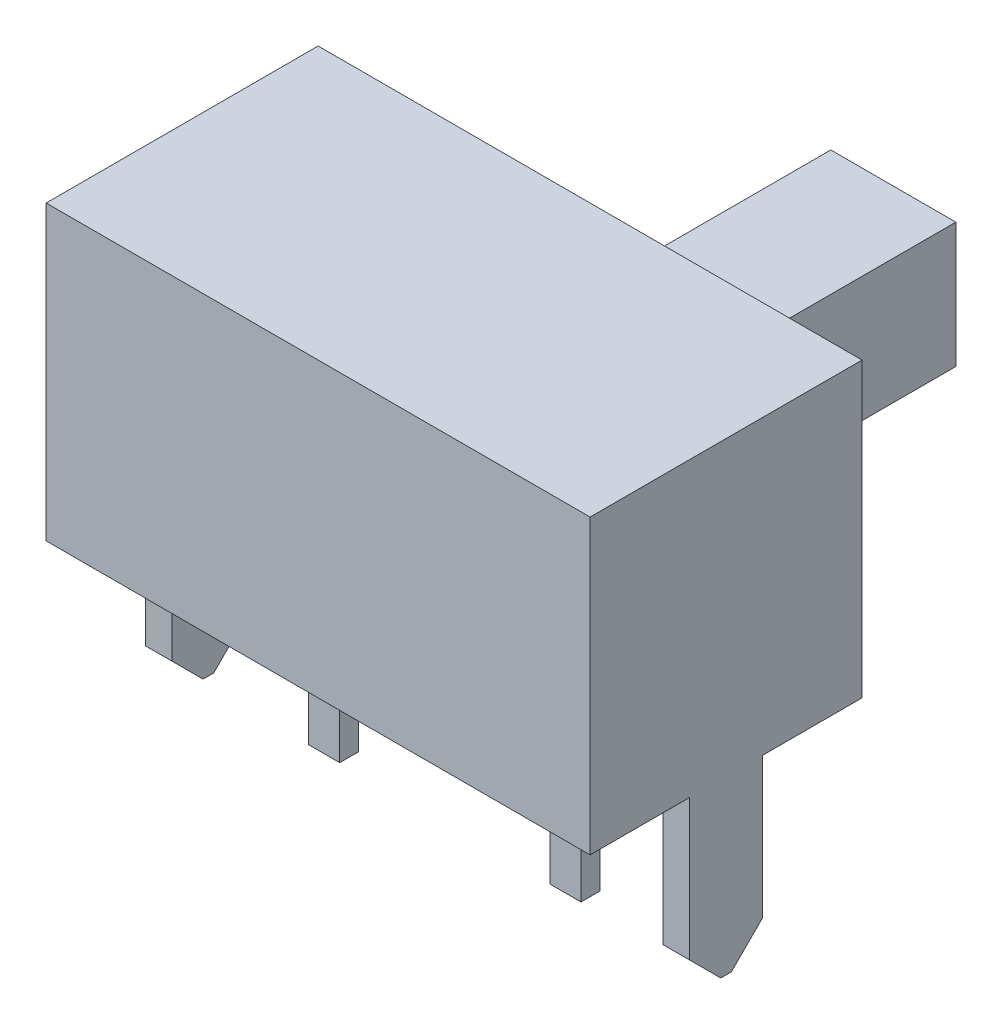
ISO-10303-21;
HEADER;
FILE_DESCRIPTION(('STEP AP214'),'2;1');
FILE_NAME('part.step','',(''),(''),'','','');
FILE_SCHEMA(('AUTOMOTIVE_DESIGN { 1 0 10303 214 1 1 1 1 }'));
ENDSEC;
DATA;
#1=APPLICATION_CONTEXT('core data for automotive mechanical design processes');
#2=APPLICATION_PROTOCOL_DEFINITION('international standard','automotive_design',2000,#1);
#3=PRODUCT_CONTEXT('',#1,'mechanical');
#4=PRODUCT('Part','Part','',(#3));
#5=PRODUCT_RELATED_PRODUCT_CATEGORY('part','',(#4));
#6=PRODUCT_DEFINITION_FORMATION('','',#4);
#7=PRODUCT_DEFINITION_CONTEXT('part definition',#1,'design');
#8=PRODUCT_DEFINITION('design','',#6,#7);
#9=PRODUCT_DEFINITION_SHAPE('','',#8);
#10=(LENGTH_UNIT() NAMED_UNIT(*) SI_UNIT(.MILLI.,.METRE.));
#11=(NAMED_UNIT(*) PLANE_ANGLE_UNIT() SI_UNIT($,.RADIAN.));
#12=(NAMED_UNIT(*) SI_UNIT($,.STERADIAN.) SOLID_ANGLE_UNIT());
#13=UNCERTAINTY_MEASURE_WITH_UNIT(LENGTH_MEASURE(1.E-05),#10,'distance_accuracy_value','');
#14=(GEOMETRIC_REPRESENTATION_CONTEXT(3) GLOBAL_UNCERTAINTY_ASSIGNED_CONTEXT((#13)) GLOBAL_UNIT_ASSIGNED_CONTEXT((#10,
#11,#12)) REPRESENTATION_CONTEXT('',''));
#15=CARTESIAN_POINT('',(0.,0.,0.));
#16=DIRECTION('',(0.,0.,1.));
#17=DIRECTION('',(1.,0.,0.));
#18=AXIS2_PLACEMENT_3D('',#15,#16,#17);
#19=CARTESIAN_POINT('',(0.,0.,0.));
#20=DIRECTION('',(0.,-1.,0.));
#21=DIRECTION('',(0.,0.,-1.));
#22=AXIS2_PLACEMENT_3D('',#19,#20,#21);
#23=PLANE('',#22);
#24=DIRECTION('',(-1.,0.,0.));
#25=VECTOR('',#24,1.);
#26=CARTESIAN_POINT('',(-3.93,0.,-0.584999999999999));
#27=LINE('',#26,#25);
#28=CARTESIAN_POINT('',(-3.93,0.,-0.584999999999999));
#29=VERTEX_POINT('',#28);
#30=CARTESIAN_POINT('',(-4.35,0.,-0.584999999999999));
#31=VERTEX_POINT('',#30);
#32=EDGE_CURVE('E233',#29,#31,#27,.T.);
#33=ORIENTED_EDGE('',*,*,#32,.T.);
#34=DIRECTION('',(0.,0.,1.));
#35=VECTOR('',#34,1.);
#36=CARTESIAN_POINT('',(-4.35,0.,2.175));
#37=LINE('',#36,#35);
#38=CARTESIAN_POINT('',(-4.35,0.,-2.175));
#39=VERTEX_POINT('',#38);
#40=EDGE_CURVE('E244',#39,#31,#37,.T.);
#41=ORIENTED_EDGE('',*,*,#40,.F.);
#42=DIRECTION('',(-1.,0.,0.));
#43=VECTOR('',#42,1.);
#44=CARTESIAN_POINT('',(-4.35,0.,-2.175));
#45=LINE('',#44,#43);
#46=CARTESIAN_POINT('',(4.35,0.,-2.175));
#47=VERTEX_POINT('',#46);
#48=EDGE_CURVE('E260',#47,#39,#45,.T.);
#49=ORIENTED_EDGE('',*,*,#48,.F.);
#50=DIRECTION('',(0.,0.,-1.));
#51=VECTOR('',#50,1.);
#52=CARTESIAN_POINT('',(4.35,0.,2.175));
#53=LINE('',#52,#51);
#54=CARTESIAN_POINT('',(4.35,0.,-0.584999999999999));
#55=VERTEX_POINT('',#54);
#56=EDGE_CURVE('E446',#55,#47,#53,.T.);
#57=ORIENTED_EDGE('',*,*,#56,.F.);
#58=DIRECTION('',(1.,0.,0.));
#59=VECTOR('',#58,1.);
#60=CARTESIAN_POINT('',(3.93,0.,-0.584999999999999));
#61=LINE('',#60,#59);
#62=CARTESIAN_POINT('',(3.93,0.,-0.584999999999999));
#63=VERTEX_POINT('',#62);
#64=EDGE_CURVE('E366',#63,#55,#61,.T.);
#65=ORIENTED_EDGE('',*,*,#64,.F.);
#66=DIRECTION('',(0.,0.,-1.));
#67=VECTOR('',#66,1.);
#68=CARTESIAN_POINT('',(3.93,0.,-0.584999999999999));
#69=LINE('',#68,#67);
#70=CARTESIAN_POINT('',(3.93,0.,0.585000000000001));
#71=VERTEX_POINT('',#70);
#72=EDGE_CURVE('E373',#71,#63,#69,.T.);
#73=ORIENTED_EDGE('',*,*,#72,.F.);
#74=DIRECTION('',(-1.,0.,0.));
#75=VECTOR('',#74,1.);
#76=CARTESIAN_POINT('',(3.93,0.,0.585000000000001));
#77=LINE('',#76,#75);
#78=CARTESIAN_POINT('',(4.35,0.,0.585000000000001));
#79=VERTEX_POINT('',#78);
#80=EDGE_CURVE('E370',#79,#71,#77,.T.);
#81=ORIENTED_EDGE('',*,*,#80,.F.);
#82=CARTESIAN_POINT('',(4.35,0.,2.175));
#83=VERTEX_POINT('',#82);
#84=EDGE_CURVE('E453',#83,#79,#53,.T.);
#85=ORIENTED_EDGE('',*,*,#84,.F.);
#86=DIRECTION('',(1.,0.,0.));
#87=VECTOR('',#86,1.);
#88=CARTESIAN_POINT('',(-4.35,0.,2.175));
#89=LINE('',#88,#87);
#90=CARTESIAN_POINT('',(-4.35,0.,2.175));
#91=VERTEX_POINT('',#90);
#92=EDGE_CURVE('E255',#91,#83,#89,.T.);
#93=ORIENTED_EDGE('',*,*,#92,.F.);
#94=CARTESIAN_POINT('',(-4.35,0.,0.585000000000001));
#95=VERTEX_POINT('',#94);
#96=EDGE_CURVE('E256',#95,#91,#37,.T.);
#97=ORIENTED_EDGE('',*,*,#96,.F.);
#98=DIRECTION('',(1.,0.,0.));
#99=VECTOR('',#98,1.);
#100=CARTESIAN_POINT('',(-3.93,0.,0.585000000000001));
#101=LINE('',#100,#99);
#102=CARTESIAN_POINT('',(-3.93,0.,0.585000000000001));
#103=VERTEX_POINT('',#102);
#104=EDGE_CURVE('E313',#95,#103,#101,.T.);
#105=ORIENTED_EDGE('',*,*,#104,.T.);
#106=DIRECTION('',(0.,0.,-1.));
#107=VECTOR('',#106,1.);
#108=CARTESIAN_POINT('',(-3.93,0.,-0.584999999999999));
#109=LINE('',#108,#107);
#110=EDGE_CURVE('E247',#103,#29,#109,.T.);
#111=ORIENTED_EDGE('',*,*,#110,.T.);
#112=EDGE_LOOP('',(#33,#41,#49,#57,#65,#73,#81,#85,#93,#97,#105,#111));
#113=FACE_BOUND('',#112,.T.);
#114=DIRECTION('',(0.,0.,-1.));
#115=VECTOR('',#114,1.);
#116=CARTESIAN_POINT('',(-1.68,0.,0.15));
#117=LINE('',#116,#115);
#118=CARTESIAN_POINT('',(-1.68,0.,0.15));
#119=VERTEX_POINT('',#118);
#120=CARTESIAN_POINT('',(-1.68,0.,-0.15));
#121=VERTEX_POINT('',#120);
#122=EDGE_CURVE('E345',#119,#121,#117,.T.);
#123=ORIENTED_EDGE('',*,*,#122,.T.);
#124=DIRECTION('',(-1.,0.,0.));
#125=VECTOR('',#124,1.);
#126=CARTESIAN_POINT('',(-2.18,0.,-0.15));
#127=LINE('',#126,#125);
#128=CARTESIAN_POINT('',(-2.18,0.,-0.15));
#129=VERTEX_POINT('',#128);
#130=EDGE_CURVE('E335',#121,#129,#127,.T.);
#131=ORIENTED_EDGE('',*,*,#130,.T.);
#132=DIRECTION('',(0.,0.,1.));
#133=VECTOR('',#132,1.);
#134=CARTESIAN_POINT('',(-2.18,0.,0.15));
#135=LINE('',#134,#133);
#136=CARTESIAN_POINT('',(-2.18,0.,0.15));
#137=VERTEX_POINT('',#136);
#138=EDGE_CURVE('E349',#129,#137,#135,.T.);
#139=ORIENTED_EDGE('',*,*,#138,.T.);
#140=DIRECTION('',(1.,0.,0.));
#141=VECTOR('',#140,1.);
#142=CARTESIAN_POINT('',(-2.18,0.,0.15));
#143=LINE('',#142,#141);
#144=EDGE_CURVE('E347',#137,#119,#143,.T.);
#145=ORIENTED_EDGE('',*,*,#144,.T.);
#146=EDGE_LOOP('',(#123,#131,#139,#145));
#147=FACE_BOUND('',#146,.T.);
#148=DIRECTION('',(1.,0.,0.));
#149=VECTOR('',#148,1.);
#150=CARTESIAN_POINT('',(2.18,0.,-0.15));
#151=LINE('',#150,#149);
#152=CARTESIAN_POINT('',(1.68,0.,-0.15));
#153=VERTEX_POINT('',#152);
#154=CARTESIAN_POINT('',(2.18,0.,-0.15));
#155=VERTEX_POINT('',#154);
#156=EDGE_CURVE('E403',#153,#155,#151,.T.);
#157=ORIENTED_EDGE('',*,*,#156,.F.);
#158=DIRECTION('',(0.,0.,-1.));
#159=VECTOR('',#158,1.);
#160=CARTESIAN_POINT('',(1.68,0.,0.15));
#161=LINE('',#160,#159);
#162=CARTESIAN_POINT('',(1.68,0.,0.15));
#163=VERTEX_POINT('',#162);
#164=EDGE_CURVE('E374',#163,#153,#161,.T.);
#165=ORIENTED_EDGE('',*,*,#164,.F.);
#166=DIRECTION('',(-1.,0.,0.));
#167=VECTOR('',#166,1.);
#168=CARTESIAN_POINT('',(2.18,0.,0.15));
#169=LINE('',#168,#167);
#170=CARTESIAN_POINT('',(2.18,0.,0.15));
#171=VERTEX_POINT('',#170);
#172=EDGE_CURVE('E397',#171,#163,#169,.T.);
#173=ORIENTED_EDGE('',*,*,#172,.F.);
#174=DIRECTION('',(0.,0.,1.));
#175=VECTOR('',#174,1.);
#176=CARTESIAN_POINT('',(2.18,0.,0.15));
#177=LINE('',#176,#175);
#178=EDGE_CURVE('E399',#155,#171,#177,.T.);
#179=ORIENTED_EDGE('',*,*,#178,.F.);
#180=EDGE_LOOP('',(#157,#165,#173,#179));
#181=FACE_BOUND('',#180,.T.);
#182=ADVANCED_FACE('F41',(#113,#147,#181),#23,.T.);
#183=CARTESIAN_POINT('',(-4.35,4.68,-2.175));
#184=DIRECTION('',(0.,0.,1.));
#185=DIRECTION('',(1.,0.,0.));
#186=AXIS2_PLACEMENT_3D('',#183,#184,#185);
#187=PLANE('',#186);
#188=ORIENTED_EDGE('',*,*,#48,.T.);
#189=DIRECTION('',(0.,-1.,0.));
#190=VECTOR('',#189,1.);
#191=CARTESIAN_POINT('',(-4.35,4.68,-2.175));
#192=LINE('',#191,#190);
#193=CARTESIAN_POINT('',(-4.35,4.68,-2.175));
#194=VERTEX_POINT('',#193);
#195=EDGE_CURVE('E254',#194,#39,#192,.T.);
#196=ORIENTED_EDGE('',*,*,#195,.F.);
#197=DIRECTION('',(-1.,0.,0.));
#198=VECTOR('',#197,1.);
#199=CARTESIAN_POINT('',(-4.35,4.68,-2.175));
#200=LINE('',#199,#198);
#201=CARTESIAN_POINT('',(4.35,4.68,-2.175));
#202=VERTEX_POINT('',#201);
#203=EDGE_CURVE('E449',#202,#194,#200,.T.);
#204=ORIENTED_EDGE('',*,*,#203,.F.);
#205=DIRECTION('',(0.,-1.,0.));
#206=VECTOR('',#205,1.);
#207=CARTESIAN_POINT('',(4.35,4.68,-2.175));
#208=LINE('',#207,#206);
#209=EDGE_CURVE('E272',#202,#47,#208,.T.);
#210=ORIENTED_EDGE('',*,*,#209,.T.);
#211=EDGE_LOOP('',(#188,#196,#204,#210));
#212=FACE_BOUND('',#211,.T.);
#213=DIRECTION('',(0.,1.,0.));
#214=VECTOR('',#213,1.);
#215=CARTESIAN_POINT('',(-0.150000000000001,1.34,-2.175));
#216=LINE('',#215,#214);
#217=CARTESIAN_POINT('',(-0.150000000000001,1.34,-2.175));
#218=VERTEX_POINT('',#217);
#219=CARTESIAN_POINT('',(-0.150000000000001,3.34,-2.175));
#220=VERTEX_POINT('',#219);
#221=EDGE_CURVE('E386',#218,#220,#216,.T.);
#222=ORIENTED_EDGE('',*,*,#221,.F.);
#223=DIRECTION('',(-1.,0.,0.));
#224=VECTOR('',#223,1.);
#225=CARTESIAN_POINT('',(1.85,1.34,-2.175));
#226=LINE('',#225,#224);
#227=CARTESIAN_POINT('',(1.85,1.34,-2.175));
#228=VERTEX_POINT('',#227);
#229=EDGE_CURVE('E418',#228,#218,#226,.T.);
#230=ORIENTED_EDGE('',*,*,#229,.F.);
#231=DIRECTION('',(0.,-1.,0.));
#232=VECTOR('',#231,1.);
#233=CARTESIAN_POINT('',(1.85,1.34,-2.175));
#234=LINE('',#233,#232);
#235=CARTESIAN_POINT('',(1.85,3.34,-2.175));
#236=VERTEX_POINT('',#235);
#237=EDGE_CURVE('E430',#236,#228,#234,.T.);
#238=ORIENTED_EDGE('',*,*,#237,.F.);
#239=DIRECTION('',(1.,0.,0.));
#240=VECTOR('',#239,1.);
#241=CARTESIAN_POINT('',(1.85,3.34,-2.175));
#242=LINE('',#241,#240);
#243=EDGE_CURVE('E427',#220,#236,#242,.T.);
#244=ORIENTED_EDGE('',*,*,#243,.F.);
#245=EDGE_LOOP('',(#222,#230,#238,#244));
#246=FACE_BOUND('',#245,.T.);
#247=ADVANCED_FACE('F465',(#212,#246),#187,.F.);
#248=CARTESIAN_POINT('',(4.35,4.68,2.175));
#249=DIRECTION('',(-1.,0.,0.));
#250=DIRECTION('',(0.,0.,1.));
#251=AXIS2_PLACEMENT_3D('',#248,#249,#250);
#252=PLANE('',#251);
#253=DIRECTION('',(0.,1.,0.));
#254=VECTOR('',#253,1.);
#255=CARTESIAN_POINT('',(4.35,-2.75,0.585000000000001));
#256=LINE('',#255,#254);
#257=CARTESIAN_POINT('',(4.35,-2.25,0.585000000000001));
#258=VERTEX_POINT('',#257);
#259=EDGE_CURVE('E384',#258,#79,#256,.T.);
#260=ORIENTED_EDGE('',*,*,#259,.F.);
#261=DIRECTION('',(0.,0.707106781186549,0.707106781186546));
#262=VECTOR('',#261,1.);
#263=CARTESIAN_POINT('',(4.35,-2.75,0.0850000000000003));
#264=LINE('',#263,#262);
#265=CARTESIAN_POINT('',(4.35,-2.75,0.0850000000000001));
#266=VERTEX_POINT('',#265);
#267=EDGE_CURVE('E289',#258,#266,#264,.F.);
#268=ORIENTED_EDGE('',*,*,#267,.T.);
#269=DIRECTION('',(0.,0.,1.));
#270=VECTOR('',#269,1.);
#271=CARTESIAN_POINT('',(4.35,-2.75,-0.584999999999999));
#272=LINE('',#271,#270);
#273=CARTESIAN_POINT('',(4.35,-2.75,-0.084999999999999));
#274=VERTEX_POINT('',#273);
#275=EDGE_CURVE('E362',#274,#266,#272,.T.);
#276=ORIENTED_EDGE('',*,*,#275,.F.);
#277=DIRECTION('',(0.,-0.707106781186549,0.707106781186546));
#278=VECTOR('',#277,1.);
#279=CARTESIAN_POINT('',(4.35,-2.75,-0.0849999999999988));
#280=LINE('',#279,#278);
#281=CARTESIAN_POINT('',(4.35,-2.25,-0.584999999999999));
#282=VERTEX_POINT('',#281);
#283=EDGE_CURVE('E287',#274,#282,#280,.F.);
#284=ORIENTED_EDGE('',*,*,#283,.T.);
#285=DIRECTION('',(0.,1.,0.));
#286=VECTOR('',#285,1.);
#287=CARTESIAN_POINT('',(4.35,-2.75,-0.584999999999999));
#288=LINE('',#287,#286);
#289=EDGE_CURVE('E369',#282,#55,#288,.T.);
#290=ORIENTED_EDGE('',*,*,#289,.T.);
#291=ORIENTED_EDGE('',*,*,#56,.T.);
#292=ORIENTED_EDGE('',*,*,#209,.F.);
#293=DIRECTION('',(0.,0.,-1.));
#294=VECTOR('',#293,1.);
#295=CARTESIAN_POINT('',(4.35,4.68,2.175));
#296=LINE('',#295,#294);
#297=CARTESIAN_POINT('',(4.35,4.68,2.175));
#298=VERTEX_POINT('',#297);
#299=EDGE_CURVE('E258',#298,#202,#296,.T.);
#300=ORIENTED_EDGE('',*,*,#299,.F.);
#301=DIRECTION('',(0.,-1.,0.));
#302=VECTOR('',#301,1.);
#303=CARTESIAN_POINT('',(4.35,4.68,2.175));
#304=LINE('',#303,#302);
#305=EDGE_CURVE('E264',#298,#83,#304,.T.);
#306=ORIENTED_EDGE('',*,*,#305,.T.);
#307=ORIENTED_EDGE('',*,*,#84,.T.);
#308=EDGE_LOOP('',(#260,#268,#276,#284,#290,#291,#292,#300,#306,#307));
#309=FACE_BOUND('',#308,.T.);
#310=ADVANCED_FACE('F460',(#309),#252,.F.);
#311=CARTESIAN_POINT('',(-4.35,4.68,2.175));
#312=DIRECTION('',(1.,0.,0.));
#313=DIRECTION('',(0.,0.,-1.));
#314=AXIS2_PLACEMENT_3D('',#311,#312,#313);
#315=PLANE('',#314);
#316=DIRECTION('',(0.,0.,1.));
#317=VECTOR('',#316,1.);
#318=CARTESIAN_POINT('',(-4.35,-2.75,-0.584999999999999));
#319=LINE('',#318,#317);
#320=CARTESIAN_POINT('',(-4.35,-2.75,-0.084999999999999));
#321=VERTEX_POINT('',#320);
#322=CARTESIAN_POINT('',(-4.35,-2.75,0.0850000000000001));
#323=VERTEX_POINT('',#322);
#324=EDGE_CURVE('E307',#321,#323,#319,.T.);
#325=ORIENTED_EDGE('',*,*,#324,.T.);
#326=DIRECTION('',(0.,0.707106781186549,0.707106781186546));
#327=VECTOR('',#326,1.);
#328=CARTESIAN_POINT('',(-4.35,-2.25,0.585000000000001));
#329=LINE('',#328,#327);
#330=CARTESIAN_POINT('',(-4.35,-2.25,0.585000000000001));
#331=VERTEX_POINT('',#330);
#332=EDGE_CURVE('E50',#323,#331,#329,.T.);
#333=ORIENTED_EDGE('',*,*,#332,.T.);
#334=DIRECTION('',(0.,1.,0.));
#335=VECTOR('',#334,1.);
#336=CARTESIAN_POINT('',(-4.35,-2.75,0.585000000000001));
#337=LINE('',#336,#335);
#338=EDGE_CURVE('E305',#331,#95,#337,.T.);
#339=ORIENTED_EDGE('',*,*,#338,.T.);
#340=ORIENTED_EDGE('',*,*,#96,.T.);
#341=DIRECTION('',(0.,-1.,0.));
#342=VECTOR('',#341,1.);
#343=CARTESIAN_POINT('',(-4.35,4.68,2.175));
#344=LINE('',#343,#342);
#345=CARTESIAN_POINT('',(-4.35,4.68,2.175));
#346=VERTEX_POINT('',#345);
#347=EDGE_CURVE('E267',#346,#91,#344,.T.);
#348=ORIENTED_EDGE('',*,*,#347,.F.);
#349=DIRECTION('',(0.,0.,1.));
#350=VECTOR('',#349,1.);
#351=CARTESIAN_POINT('',(-4.35,4.68,2.175));
#352=LINE('',#351,#350);
#353=EDGE_CURVE('E451',#194,#346,#352,.T.);
#354=ORIENTED_EDGE('',*,*,#353,.F.);
#355=ORIENTED_EDGE('',*,*,#195,.T.);
#356=ORIENTED_EDGE('',*,*,#40,.T.);
#357=DIRECTION('',(0.,1.,0.));
#358=VECTOR('',#357,1.);
#359=CARTESIAN_POINT('',(-4.35,-2.75,-0.584999999999999));
#360=LINE('',#359,#358);
#361=CARTESIAN_POINT('',(-4.35,-2.25,-0.584999999999999));
#362=VERTEX_POINT('',#361);
#363=EDGE_CURVE('E229',#362,#31,#360,.T.);
#364=ORIENTED_EDGE('',*,*,#363,.F.);
#365=DIRECTION('',(0.,-0.707106781186549,0.707106781186546));
#366=VECTOR('',#365,1.);
#367=CARTESIAN_POINT('',(-4.35,-2.25,-0.584999999999999));
#368=LINE('',#367,#366);
#369=EDGE_CURVE('E57',#362,#321,#368,.T.);
#370=ORIENTED_EDGE('',*,*,#369,.T.);
#371=EDGE_LOOP('',(#325,#333,#339,#340,#348,#354,#355,#356,#364,#370));
#372=FACE_BOUND('',#371,.T.);
#373=ADVANCED_FACE('F251',(#372),#315,.F.);
#374=CARTESIAN_POINT('',(-4.35,4.68,2.175));
#375=DIRECTION('',(0.,0.,-1.));
#376=DIRECTION('',(-1.,0.,0.));
#377=AXIS2_PLACEMENT_3D('',#374,#375,#376);
#378=PLANE('',#377);
#379=ORIENTED_EDGE('',*,*,#92,.T.);
#380=ORIENTED_EDGE('',*,*,#305,.F.);
#381=DIRECTION('',(1.,0.,0.));
#382=VECTOR('',#381,1.);
#383=CARTESIAN_POINT('',(-4.35,4.68,2.175));
#384=LINE('',#383,#382);
#385=EDGE_CURVE('E268',#346,#298,#384,.T.);
#386=ORIENTED_EDGE('',*,*,#385,.F.);
#387=ORIENTED_EDGE('',*,*,#347,.T.);
#388=EDGE_LOOP('',(#379,#380,#386,#387));
#389=FACE_BOUND('',#388,.T.);
#390=ADVANCED_FACE('F516',(#389),#378,.F.);
#391=CARTESIAN_POINT('',(0.,4.68,0.));
#392=DIRECTION('',(0.,-1.,0.));
#393=DIRECTION('',(0.,0.,-1.));
#394=AXIS2_PLACEMENT_3D('',#391,#392,#393);
#395=PLANE('',#394);
#396=ORIENTED_EDGE('',*,*,#299,.T.);
#397=ORIENTED_EDGE('',*,*,#203,.T.);
#398=ORIENTED_EDGE('',*,*,#353,.T.);
#399=ORIENTED_EDGE('',*,*,#385,.T.);
#400=EDGE_LOOP('',(#396,#397,#398,#399));
#401=FACE_BOUND('',#400,.T.);
#402=ADVANCED_FACE('F468',(#401),#395,.F.);
#403=CARTESIAN_POINT('',(-0.150000000000001,1.34,-6.175));
#404=DIRECTION('',(1.,0.,0.));
#405=DIRECTION('',(0.,0.,-1.));
#406=AXIS2_PLACEMENT_3D('',#403,#404,#405);
#407=PLANE('',#406);
#408=ORIENTED_EDGE('',*,*,#221,.T.);
#409=DIRECTION('',(0.,0.,1.));
#410=VECTOR('',#409,1.);
#411=CARTESIAN_POINT('',(-0.150000000000001,3.34,-6.175));
#412=LINE('',#411,#410);
#413=CARTESIAN_POINT('',(-0.150000000000001,3.34,-6.175));
#414=VERTEX_POINT('',#413);
#415=EDGE_CURVE('E443',#414,#220,#412,.T.);
#416=ORIENTED_EDGE('',*,*,#415,.F.);
#417=DIRECTION('',(0.,1.,0.));
#418=VECTOR('',#417,1.);
#419=CARTESIAN_POINT('',(-0.150000000000001,1.34,-6.175));
#420=LINE('',#419,#418);
#421=CARTESIAN_POINT('',(-0.150000000000001,1.34,-6.175));
#422=VERTEX_POINT('',#421);
#423=EDGE_CURVE('E414',#422,#414,#420,.T.);
#424=ORIENTED_EDGE('',*,*,#423,.F.);
#425=DIRECTION('',(0.,0.,1.));
#426=VECTOR('',#425,1.);
#427=CARTESIAN_POINT('',(-0.150000000000001,1.34,-6.175));
#428=LINE('',#427,#426);
#429=EDGE_CURVE('E424',#422,#218,#428,.T.);
#430=ORIENTED_EDGE('',*,*,#429,.T.);
#431=EDGE_LOOP('',(#408,#416,#424,#430));
#432=FACE_BOUND('',#431,.T.);
#433=ADVANCED_FACE('F619',(#432),#407,.F.);
#434=CARTESIAN_POINT('',(1.85,3.34,-6.175));
#435=DIRECTION('',(0.,-1.,0.));
#436=DIRECTION('',(0.,0.,-1.));
#437=AXIS2_PLACEMENT_3D('',#434,#435,#436);
#438=PLANE('',#437);
#439=ORIENTED_EDGE('',*,*,#243,.T.);
#440=DIRECTION('',(0.,0.,1.));
#441=VECTOR('',#440,1.);
#442=CARTESIAN_POINT('',(1.85,3.34,-6.175));
#443=LINE('',#442,#441);
#444=CARTESIAN_POINT('',(1.85,3.34,-6.175));
#445=VERTEX_POINT('',#444);
#446=EDGE_CURVE('E440',#445,#236,#443,.T.);
#447=ORIENTED_EDGE('',*,*,#446,.F.);
#448=DIRECTION('',(1.,0.,0.));
#449=VECTOR('',#448,1.);
#450=CARTESIAN_POINT('',(1.85,3.34,-6.175));
#451=LINE('',#450,#449);
#452=EDGE_CURVE('E417',#414,#445,#451,.T.);
#453=ORIENTED_EDGE('',*,*,#452,.F.);
#454=ORIENTED_EDGE('',*,*,#415,.T.);
#455=EDGE_LOOP('',(#439,#447,#453,#454));
#456=FACE_BOUND('',#455,.T.);
#457=ADVANCED_FACE('F616',(#456),#438,.F.);
#458=CARTESIAN_POINT('',(1.85,1.34,-6.175));
#459=DIRECTION('',(-1.,0.,0.));
#460=DIRECTION('',(0.,0.,1.));
#461=AXIS2_PLACEMENT_3D('',#458,#459,#460);
#462=PLANE('',#461);
#463=ORIENTED_EDGE('',*,*,#237,.T.);
#464=DIRECTION('',(0.,0.,1.));
#465=VECTOR('',#464,1.);
#466=CARTESIAN_POINT('',(1.85,1.34,-6.175));
#467=LINE('',#466,#465);
#468=CARTESIAN_POINT('',(1.85,1.34,-6.175));
#469=VERTEX_POINT('',#468);
#470=EDGE_CURVE('E437',#469,#228,#467,.T.);
#471=ORIENTED_EDGE('',*,*,#470,.F.);
#472=DIRECTION('',(0.,-1.,0.));
#473=VECTOR('',#472,1.);
#474=CARTESIAN_POINT('',(1.85,1.34,-6.175));
#475=LINE('',#474,#473);
#476=EDGE_CURVE('E420',#445,#469,#475,.T.);
#477=ORIENTED_EDGE('',*,*,#476,.F.);
#478=ORIENTED_EDGE('',*,*,#446,.T.);
#479=EDGE_LOOP('',(#463,#471,#477,#478));
#480=FACE_BOUND('',#479,.T.);
#481=ADVANCED_FACE('F612',(#480),#462,.F.);
#482=CARTESIAN_POINT('',(1.85,1.34,-6.175));
#483=DIRECTION('',(0.,1.,0.));
#484=DIRECTION('',(0.,0.,1.));
#485=AXIS2_PLACEMENT_3D('',#482,#483,#484);
#486=PLANE('',#485);
#487=ORIENTED_EDGE('',*,*,#229,.T.);
#488=ORIENTED_EDGE('',*,*,#429,.F.);
#489=DIRECTION('',(-1.,0.,0.));
#490=VECTOR('',#489,1.);
#491=CARTESIAN_POINT('',(1.85,1.34,-6.175));
#492=LINE('',#491,#490);
#493=EDGE_CURVE('E422',#469,#422,#492,.T.);
#494=ORIENTED_EDGE('',*,*,#493,.F.);
#495=ORIENTED_EDGE('',*,*,#470,.T.);
#496=EDGE_LOOP('',(#487,#488,#494,#495));
#497=FACE_BOUND('',#496,.T.);
#498=ADVANCED_FACE('F608',(#497),#486,.F.);
#499=CARTESIAN_POINT('',(0.,0.,-6.175));
#500=DIRECTION('',(0.,0.,1.));
#501=DIRECTION('',(1.,0.,0.));
#502=AXIS2_PLACEMENT_3D('',#499,#500,#501);
#503=PLANE('',#502);
#504=ORIENTED_EDGE('',*,*,#423,.T.);
#505=ORIENTED_EDGE('',*,*,#452,.T.);
#506=ORIENTED_EDGE('',*,*,#476,.T.);
#507=ORIENTED_EDGE('',*,*,#493,.T.);
#508=EDGE_LOOP('',(#504,#505,#506,#507));
#509=FACE_BOUND('',#508,.T.);
#510=ADVANCED_FACE('F605',(#509),#503,.F.);
#511=CARTESIAN_POINT('',(1.68,-2.75,0.15));
#512=DIRECTION('',(1.,0.,0.));
#513=DIRECTION('',(0.,0.,-1.));
#514=AXIS2_PLACEMENT_3D('',#511,#512,#513);
#515=PLANE('',#514);
#516=ORIENTED_EDGE('',*,*,#164,.T.);
#517=DIRECTION('',(0.,1.,0.));
#518=VECTOR('',#517,1.);
#519=CARTESIAN_POINT('',(1.68,-2.75,-0.15));
#520=LINE('',#519,#518);
#521=CARTESIAN_POINT('',(1.68,-2.75,-0.15));
#522=VERTEX_POINT('',#521);
#523=EDGE_CURVE('E237',#522,#153,#520,.T.);
#524=ORIENTED_EDGE('',*,*,#523,.F.);
#525=DIRECTION('',(0.,0.,-1.));
#526=VECTOR('',#525,1.);
#527=CARTESIAN_POINT('',(1.68,-2.75,0.15));
#528=LINE('',#527,#526);
#529=CARTESIAN_POINT('',(1.68,-2.75,0.15));
#530=VERTEX_POINT('',#529);
#531=EDGE_CURVE('E400',#530,#522,#528,.T.);
#532=ORIENTED_EDGE('',*,*,#531,.F.);
#533=DIRECTION('',(0.,1.,0.));
#534=VECTOR('',#533,1.);
#535=CARTESIAN_POINT('',(1.68,-2.75,0.15));
#536=LINE('',#535,#534);
#537=EDGE_CURVE('E393',#530,#163,#536,.T.);
#538=ORIENTED_EDGE('',*,*,#537,.T.);
#539=EDGE_LOOP('',(#516,#524,#532,#538));
#540=FACE_BOUND('',#539,.T.);
#541=ADVANCED_FACE('F592',(#540),#515,.F.);
#542=CARTESIAN_POINT('',(2.18,-2.75,-0.15));
#543=DIRECTION('',(0.,0.,1.));
#544=DIRECTION('',(1.,0.,0.));
#545=AXIS2_PLACEMENT_3D('',#542,#543,#544);
#546=PLANE('',#545);
#547=ORIENTED_EDGE('',*,*,#156,.T.);
#548=DIRECTION('',(0.,1.,0.));
#549=VECTOR('',#548,1.);
#550=CARTESIAN_POINT('',(2.18,-2.75,-0.15));
#551=LINE('',#550,#549);
#552=CARTESIAN_POINT('',(2.18,-2.75,-0.15));
#553=VERTEX_POINT('',#552);
#554=EDGE_CURVE('E388',#553,#155,#551,.T.);
#555=ORIENTED_EDGE('',*,*,#554,.F.);
#556=DIRECTION('',(1.,0.,0.));
#557=VECTOR('',#556,1.);
#558=CARTESIAN_POINT('',(2.18,-2.75,-0.15));
#559=LINE('',#558,#557);
#560=EDGE_CURVE('E410',#522,#553,#559,.T.);
#561=ORIENTED_EDGE('',*,*,#560,.F.);
#562=ORIENTED_EDGE('',*,*,#523,.T.);
#563=EDGE_LOOP('',(#547,#555,#561,#562));
#564=FACE_BOUND('',#563,.T.);
#565=ADVANCED_FACE('F580',(#564),#546,.F.);
#566=CARTESIAN_POINT('',(2.18,-2.75,0.15));
#567=DIRECTION('',(-1.,0.,0.));
#568=DIRECTION('',(0.,0.,1.));
#569=AXIS2_PLACEMENT_3D('',#566,#567,#568);
#570=PLANE('',#569);
#571=ORIENTED_EDGE('',*,*,#178,.T.);
#572=DIRECTION('',(0.,1.,0.));
#573=VECTOR('',#572,1.);
#574=CARTESIAN_POINT('',(2.18,-2.75,0.15));
#575=LINE('',#574,#573);
#576=CARTESIAN_POINT('',(2.18,-2.75,0.15));
#577=VERTEX_POINT('',#576);
#578=EDGE_CURVE('E391',#577,#171,#575,.T.);
#579=ORIENTED_EDGE('',*,*,#578,.F.);
#580=DIRECTION('',(0.,0.,1.));
#581=VECTOR('',#580,1.);
#582=CARTESIAN_POINT('',(2.18,-2.75,0.15));
#583=LINE('',#582,#581);
#584=EDGE_CURVE('E408',#553,#577,#583,.T.);
#585=ORIENTED_EDGE('',*,*,#584,.F.);
#586=ORIENTED_EDGE('',*,*,#554,.T.);
#587=EDGE_LOOP('',(#571,#579,#585,#586));
#588=FACE_BOUND('',#587,.T.);
#589=ADVANCED_FACE('F584',(#588),#570,.F.);
#590=CARTESIAN_POINT('',(2.18,-2.75,0.15));
#591=DIRECTION('',(0.,0.,-1.));
#592=DIRECTION('',(-1.,0.,0.));
#593=AXIS2_PLACEMENT_3D('',#590,#591,#592);
#594=PLANE('',#593);
#595=ORIENTED_EDGE('',*,*,#172,.T.);
#596=ORIENTED_EDGE('',*,*,#537,.F.);
#597=DIRECTION('',(-1.,0.,0.));
#598=VECTOR('',#597,1.);
#599=CARTESIAN_POINT('',(2.18,-2.75,0.15));
#600=LINE('',#599,#598);
#601=EDGE_CURVE('E396',#577,#530,#600,.T.);
#602=ORIENTED_EDGE('',*,*,#601,.F.);
#603=ORIENTED_EDGE('',*,*,#578,.T.);
#604=EDGE_LOOP('',(#595,#596,#602,#603));
#605=FACE_BOUND('',#604,.T.);
#606=ADVANCED_FACE('F594',(#605),#594,.F.);
#607=CARTESIAN_POINT('',(0.,-2.75,0.));
#608=DIRECTION('',(0.,1.,0.));
#609=DIRECTION('',(0.,0.,1.));
#610=AXIS2_PLACEMENT_3D('',#607,#608,#609);
#611=PLANE('',#610);
#612=ORIENTED_EDGE('',*,*,#531,.T.);
#613=ORIENTED_EDGE('',*,*,#560,.T.);
#614=ORIENTED_EDGE('',*,*,#584,.T.);
#615=ORIENTED_EDGE('',*,*,#601,.T.);
#616=EDGE_LOOP('',(#612,#613,#614,#615));
#617=FACE_BOUND('',#616,.T.);
#618=ADVANCED_FACE('F588',(#617),#611,.F.);
#619=CARTESIAN_POINT('',(3.93,-2.75,0.585000000000001));
#620=DIRECTION('',(0.,0.,-1.));
#621=DIRECTION('',(-1.,0.,0.));
#622=AXIS2_PLACEMENT_3D('',#619,#620,#621);
#623=PLANE('',#622);
#624=DIRECTION('',(0.,1.,0.));
#625=VECTOR('',#624,1.);
#626=CARTESIAN_POINT('',(3.93,-2.75,0.585000000000001));
#627=LINE('',#626,#625);
#628=CARTESIAN_POINT('',(3.93,-2.25,0.585000000000001));
#629=VERTEX_POINT('',#628);
#630=EDGE_CURVE('E382',#629,#71,#627,.T.);
#631=ORIENTED_EDGE('',*,*,#630,.F.);
#632=DIRECTION('',(1.,0.,0.));
#633=VECTOR('',#632,1.);
#634=CARTESIAN_POINT('',(3.93,-2.25,0.585000000000001));
#635=LINE('',#634,#633);
#636=EDGE_CURVE('E285',#629,#258,#635,.T.);
#637=ORIENTED_EDGE('',*,*,#636,.T.);
#638=ORIENTED_EDGE('',*,*,#259,.T.);
#639=ORIENTED_EDGE('',*,*,#80,.T.);
#640=EDGE_LOOP('',(#631,#637,#638,#639));
#641=FACE_BOUND('',#640,.T.);
#642=ADVANCED_FACE('F477',(#641),#623,.F.);
#643=CARTESIAN_POINT('',(3.93,-2.75,-0.584999999999999));
#644=DIRECTION('',(1.,0.,0.));
#645=DIRECTION('',(0.,0.,-1.));
#646=AXIS2_PLACEMENT_3D('',#643,#644,#645);
#647=PLANE('',#646);
#648=DIRECTION('',(0.,0.,-1.));
#649=VECTOR('',#648,1.);
#650=CARTESIAN_POINT('',(3.93,-2.75,-0.584999999999999));
#651=LINE('',#650,#649);
#652=CARTESIAN_POINT('',(3.93,-2.75,0.0850000000000001));
#653=VERTEX_POINT('',#652);
#654=CARTESIAN_POINT('',(3.93,-2.75,-0.084999999999999));
#655=VERTEX_POINT('',#654);
#656=EDGE_CURVE('E365',#653,#655,#651,.T.);
#657=ORIENTED_EDGE('',*,*,#656,.F.);
#658=DIRECTION('',(0.,-0.707106781186549,-0.707106781186546));
#659=VECTOR('',#658,1.);
#660=CARTESIAN_POINT('',(3.93,-2.75,0.0850000000000003));
#661=LINE('',#660,#659);
#662=EDGE_CURVE('E283',#653,#629,#661,.F.);
#663=ORIENTED_EDGE('',*,*,#662,.T.);
#664=ORIENTED_EDGE('',*,*,#630,.T.);
#665=ORIENTED_EDGE('',*,*,#72,.T.);
#666=DIRECTION('',(0.,1.,0.));
#667=VECTOR('',#666,1.);
#668=CARTESIAN_POINT('',(3.93,-2.75,-0.584999999999999));
#669=LINE('',#668,#667);
#670=CARTESIAN_POINT('',(3.93,-2.25,-0.584999999999999));
#671=VERTEX_POINT('',#670);
#672=EDGE_CURVE('E380',#671,#63,#669,.T.);
#673=ORIENTED_EDGE('',*,*,#672,.F.);
#674=DIRECTION('',(0.,0.707106781186549,-0.707106781186546));
#675=VECTOR('',#674,1.);
#676=CARTESIAN_POINT('',(3.93,-2.75,-0.0849999999999988));
#677=LINE('',#676,#675);
#678=EDGE_CURVE('E281',#671,#655,#677,.F.);
#679=ORIENTED_EDGE('',*,*,#678,.T.);
#680=EDGE_LOOP('',(#657,#663,#664,#665,#673,#679));
#681=FACE_BOUND('',#680,.T.);
#682=ADVANCED_FACE('F489',(#681),#647,.F.);
#683=CARTESIAN_POINT('',(3.93,-2.75,-0.584999999999999));
#684=DIRECTION('',(0.,0.,1.));
#685=DIRECTION('',(1.,0.,0.));
#686=AXIS2_PLACEMENT_3D('',#683,#684,#685);
#687=PLANE('',#686);
#688=ORIENTED_EDGE('',*,*,#289,.F.);
#689=DIRECTION('',(-1.,0.,0.));
#690=VECTOR('',#689,1.);
#691=CARTESIAN_POINT('',(3.93,-2.25,-0.584999999999999));
#692=LINE('',#691,#690);
#693=EDGE_CURVE('E291',#282,#671,#692,.T.);
#694=ORIENTED_EDGE('',*,*,#693,.T.);
#695=ORIENTED_EDGE('',*,*,#672,.T.);
#696=ORIENTED_EDGE('',*,*,#64,.T.);
#697=EDGE_LOOP('',(#688,#694,#695,#696));
#698=FACE_BOUND('',#697,.T.);
#699=ADVANCED_FACE('F496',(#698),#687,.F.);
#700=CARTESIAN_POINT('',(0.,-2.75,0.));
#701=DIRECTION('',(0.,1.,0.));
#702=DIRECTION('',(0.,0.,1.));
#703=AXIS2_PLACEMENT_3D('',#700,#701,#702);
#704=PLANE('',#703);
#705=ORIENTED_EDGE('',*,*,#275,.T.);
#706=DIRECTION('',(-1.,0.,0.));
#707=VECTOR('',#706,1.);
#708=CARTESIAN_POINT('',(0.,-2.75,0.0850000000000003));
#709=LINE('',#708,#707);
#710=EDGE_CURVE('E278',#266,#653,#709,.T.);
#711=ORIENTED_EDGE('',*,*,#710,.T.);
#712=ORIENTED_EDGE('',*,*,#656,.T.);
#713=DIRECTION('',(1.,0.,0.));
#714=VECTOR('',#713,1.);
#715=CARTESIAN_POINT('',(0.,-2.75,-0.0849999999999988));
#716=LINE('',#715,#714);
#717=EDGE_CURVE('E275',#655,#274,#716,.T.);
#718=ORIENTED_EDGE('',*,*,#717,.T.);
#719=EDGE_LOOP('',(#705,#711,#712,#718));
#720=FACE_BOUND('',#719,.T.);
#721=ADVANCED_FACE('F486',(#720),#704,.F.);
#722=CARTESIAN_POINT('',(0.,-2.75,0.0850000000000003));
#723=DIRECTION('',(0.,0.707106781186546,-0.707106781186549));
#724=DIRECTION('',(-1.,0.,0.));
#725=AXIS2_PLACEMENT_3D('',#722,#723,#724);
#726=PLANE('',#725);
#727=ORIENTED_EDGE('',*,*,#267,.F.);
#728=ORIENTED_EDGE('',*,*,#636,.F.);
#729=ORIENTED_EDGE('',*,*,#662,.F.);
#730=ORIENTED_EDGE('',*,*,#710,.F.);
#731=EDGE_LOOP('',(#727,#728,#729,#730));
#732=FACE_BOUND('',#731,.T.);
#733=ADVANCED_FACE('F483',(#732),#726,.F.);
#734=CARTESIAN_POINT('',(0.,-2.75,-0.0849999999999988));
#735=DIRECTION('',(0.,0.707106781186546,0.707106781186549));
#736=DIRECTION('',(1.,0.,0.));
#737=AXIS2_PLACEMENT_3D('',#734,#735,#736);
#738=PLANE('',#737);
#739=ORIENTED_EDGE('',*,*,#678,.F.);
#740=ORIENTED_EDGE('',*,*,#693,.F.);
#741=ORIENTED_EDGE('',*,*,#283,.F.);
#742=ORIENTED_EDGE('',*,*,#717,.F.);
#743=EDGE_LOOP('',(#739,#740,#741,#742));
#744=FACE_BOUND('',#743,.T.);
#745=ADVANCED_FACE('F494',(#744),#738,.F.);
#746=CARTESIAN_POINT('',(-3.93,-2.75,-0.584999999999999));
#747=DIRECTION('',(0.,0.,-1.));
#748=DIRECTION('',(-1.,0.,0.));
#749=AXIS2_PLACEMENT_3D('',#746,#747,#748);
#750=PLANE('',#749);
#751=DIRECTION('',(0.,1.,0.));
#752=VECTOR('',#751,1.);
#753=CARTESIAN_POINT('',(-3.93,-2.75,-0.584999999999999));
#754=LINE('',#753,#752);
#755=CARTESIAN_POINT('',(-3.93,-2.25,-0.584999999999999));
#756=VERTEX_POINT('',#755);
#757=EDGE_CURVE('E238',#756,#29,#754,.T.);
#758=ORIENTED_EDGE('',*,*,#757,.F.);
#759=DIRECTION('',(-1.,0.,0.));
#760=VECTOR('',#759,1.);
#761=CARTESIAN_POINT('',(-4.35,-2.25,-0.584999999999999));
#762=LINE('',#761,#760);
#763=EDGE_CURVE('E11',#756,#362,#762,.T.);
#764=ORIENTED_EDGE('',*,*,#763,.T.);
#765=ORIENTED_EDGE('',*,*,#363,.T.);
#766=ORIENTED_EDGE('',*,*,#32,.F.);
#767=EDGE_LOOP('',(#758,#764,#765,#766));
#768=FACE_BOUND('',#767,.T.);
#769=ADVANCED_FACE('F232',(#768),#750,.T.);
#770=CARTESIAN_POINT('',(-3.93,-2.75,-0.584999999999999));
#771=DIRECTION('',(1.,0.,0.));
#772=DIRECTION('',(0.,0.,-1.));
#773=AXIS2_PLACEMENT_3D('',#770,#771,#772);
#774=PLANE('',#773);
#775=DIRECTION('',(0.,1.,0.));
#776=VECTOR('',#775,1.);
#777=CARTESIAN_POINT('',(-3.93,-2.75,0.585000000000001));
#778=LINE('',#777,#776);
#779=CARTESIAN_POINT('',(-3.93,-2.25,0.585000000000001));
#780=VERTEX_POINT('',#779);
#781=EDGE_CURVE('E315',#780,#103,#778,.T.);
#782=ORIENTED_EDGE('',*,*,#781,.F.);
#783=DIRECTION('',(0.,-0.707106781186549,-0.707106781186546));
#784=VECTOR('',#783,1.);
#785=CARTESIAN_POINT('',(-3.93,-3.085,-0.249999999999998));
#786=LINE('',#785,#784);
#787=CARTESIAN_POINT('',(-3.93,-2.75,0.0850000000000001));
#788=VERTEX_POINT('',#787);
#789=EDGE_CURVE('E298',#780,#788,#786,.T.);
#790=ORIENTED_EDGE('',*,*,#789,.T.);
#791=DIRECTION('',(0.,0.,-1.));
#792=VECTOR('',#791,1.);
#793=CARTESIAN_POINT('',(-3.93,-2.75,-0.584999999999999));
#794=LINE('',#793,#792);
#795=CARTESIAN_POINT('',(-3.93,-2.75,-0.084999999999999));
#796=VERTEX_POINT('',#795);
#797=EDGE_CURVE('E316',#788,#796,#794,.T.);
#798=ORIENTED_EDGE('',*,*,#797,.T.);
#799=DIRECTION('',(0.,0.707106781186549,-0.707106781186546));
#800=VECTOR('',#799,1.);
#801=CARTESIAN_POINT('',(-3.93,-2.5,-0.334999999999998));
#802=LINE('',#801,#800);
#803=EDGE_CURVE('E296',#796,#756,#802,.T.);
#804=ORIENTED_EDGE('',*,*,#803,.T.);
#805=ORIENTED_EDGE('',*,*,#757,.T.);
#806=ORIENTED_EDGE('',*,*,#110,.F.);
#807=EDGE_LOOP('',(#782,#790,#798,#804,#805,#806));
#808=FACE_BOUND('',#807,.T.);
#809=ADVANCED_FACE('F321',(#808),#774,.T.);
#810=CARTESIAN_POINT('',(-3.93,-2.75,0.585000000000001));
#811=DIRECTION('',(0.,0.,1.));
#812=DIRECTION('',(1.,0.,0.));
#813=AXIS2_PLACEMENT_3D('',#810,#811,#812);
#814=PLANE('',#813);
#815=ORIENTED_EDGE('',*,*,#338,.F.);
#816=DIRECTION('',(1.,0.,0.));
#817=VECTOR('',#816,1.);
#818=CARTESIAN_POINT('',(-3.93,-2.25,0.585000000000001));
#819=LINE('',#818,#817);
#820=EDGE_CURVE('E293',#331,#780,#819,.T.);
#821=ORIENTED_EDGE('',*,*,#820,.T.);
#822=ORIENTED_EDGE('',*,*,#781,.T.);
#823=ORIENTED_EDGE('',*,*,#104,.F.);
#824=EDGE_LOOP('',(#815,#821,#822,#823));
#825=FACE_BOUND('',#824,.T.);
#826=ADVANCED_FACE('F311',(#825),#814,.T.);
#827=CARTESIAN_POINT('',(0.,-2.75,0.));
#828=DIRECTION('',(0.,1.,0.));
#829=DIRECTION('',(0.,0.,1.));
#830=AXIS2_PLACEMENT_3D('',#827,#828,#829);
#831=PLANE('',#830);
#832=ORIENTED_EDGE('',*,*,#797,.F.);
#833=DIRECTION('',(-1.,0.,0.));
#834=VECTOR('',#833,1.);
#835=CARTESIAN_POINT('',(-4.35,-2.75,0.0850000000000003));
#836=LINE('',#835,#834);
#837=EDGE_CURVE('E64',#788,#323,#836,.T.);
#838=ORIENTED_EDGE('',*,*,#837,.T.);
#839=ORIENTED_EDGE('',*,*,#324,.F.);
#840=DIRECTION('',(1.,0.,0.));
#841=VECTOR('',#840,1.);
#842=CARTESIAN_POINT('',(-3.93,-2.75,-0.0849999999999988));
#843=LINE('',#842,#841);
#844=EDGE_CURVE('E300',#321,#796,#843,.T.);
#845=ORIENTED_EDGE('',*,*,#844,.T.);
#846=EDGE_LOOP('',(#832,#838,#839,#845));
#847=FACE_BOUND('',#846,.T.);
#848=ADVANCED_FACE('F323',(#847),#831,.F.);
#849=CARTESIAN_POINT('',(-1.68,-2.75,0.15));
#850=DIRECTION('',(1.,0.,0.));
#851=DIRECTION('',(0.,0.,-1.));
#852=AXIS2_PLACEMENT_3D('',#849,#850,#851);
#853=PLANE('',#852);
#854=ORIENTED_EDGE('',*,*,#122,.F.);
#855=DIRECTION('',(0.,1.,0.));
#856=VECTOR('',#855,1.);
#857=CARTESIAN_POINT('',(-1.68,-2.75,0.15));
#858=LINE('',#857,#856);
#859=CARTESIAN_POINT('',(-1.68,-2.75,0.15));
#860=VERTEX_POINT('',#859);
#861=EDGE_CURVE('E248',#860,#119,#858,.T.);
#862=ORIENTED_EDGE('',*,*,#861,.F.);
#863=DIRECTION('',(0.,0.,-1.));
#864=VECTOR('',#863,1.);
#865=CARTESIAN_POINT('',(-1.68,-2.75,0.15));
#866=LINE('',#865,#864);
#867=CARTESIAN_POINT('',(-1.68,-2.75,-0.15));
#868=VERTEX_POINT('',#867);
#869=EDGE_CURVE('E331',#860,#868,#866,.T.);
#870=ORIENTED_EDGE('',*,*,#869,.T.);
#871=DIRECTION('',(0.,1.,0.));
#872=VECTOR('',#871,1.);
#873=CARTESIAN_POINT('',(-1.68,-2.75,-0.15));
#874=LINE('',#873,#872);
#875=EDGE_CURVE('E344',#868,#121,#874,.T.);
#876=ORIENTED_EDGE('',*,*,#875,.T.);
#877=EDGE_LOOP('',(#854,#862,#870,#876));
#878=FACE_BOUND('',#877,.T.);
#879=ADVANCED_FACE('F558',(#878),#853,.T.);
#880=CARTESIAN_POINT('',(-2.18,-2.75,0.15));
#881=DIRECTION('',(0.,0.,1.));
#882=DIRECTION('',(1.,0.,0.));
#883=AXIS2_PLACEMENT_3D('',#880,#881,#882);
#884=PLANE('',#883);
#885=ORIENTED_EDGE('',*,*,#144,.F.);
#886=DIRECTION('',(0.,1.,0.));
#887=VECTOR('',#886,1.);
#888=CARTESIAN_POINT('',(-2.18,-2.75,0.15));
#889=LINE('',#888,#887);
#890=CARTESIAN_POINT('',(-2.18,-2.75,0.15));
#891=VERTEX_POINT('',#890);
#892=EDGE_CURVE('E357',#891,#137,#889,.T.);
#893=ORIENTED_EDGE('',*,*,#892,.F.);
#894=DIRECTION('',(1.,0.,0.));
#895=VECTOR('',#894,1.);
#896=CARTESIAN_POINT('',(-2.18,-2.75,0.15));
#897=LINE('',#896,#895);
#898=EDGE_CURVE('E334',#891,#860,#897,.T.);
#899=ORIENTED_EDGE('',*,*,#898,.T.);
#900=ORIENTED_EDGE('',*,*,#861,.T.);
#901=EDGE_LOOP('',(#885,#893,#899,#900));
#902=FACE_BOUND('',#901,.T.);
#903=ADVANCED_FACE('F554',(#902),#884,.T.);
#904=CARTESIAN_POINT('',(-2.18,-2.75,0.15));
#905=DIRECTION('',(-1.,0.,0.));
#906=DIRECTION('',(0.,0.,1.));
#907=AXIS2_PLACEMENT_3D('',#904,#905,#906);
#908=PLANE('',#907);
#909=ORIENTED_EDGE('',*,*,#138,.F.);
#910=DIRECTION('',(0.,1.,0.));
#911=VECTOR('',#910,1.);
#912=CARTESIAN_POINT('',(-2.18,-2.75,-0.15));
#913=LINE('',#912,#911);
#914=CARTESIAN_POINT('',(-2.18,-2.75,-0.15));
#915=VERTEX_POINT('',#914);
#916=EDGE_CURVE('E354',#915,#129,#913,.T.);
#917=ORIENTED_EDGE('',*,*,#916,.F.);
#918=DIRECTION('',(0.,0.,1.));
#919=VECTOR('',#918,1.);
#920=CARTESIAN_POINT('',(-2.18,-2.75,0.15));
#921=LINE('',#920,#919);
#922=EDGE_CURVE('E338',#915,#891,#921,.T.);
#923=ORIENTED_EDGE('',*,*,#922,.T.);
#924=ORIENTED_EDGE('',*,*,#892,.T.);
#925=EDGE_LOOP('',(#909,#917,#923,#924));
#926=FACE_BOUND('',#925,.T.);
#927=ADVANCED_FACE('F545',(#926),#908,.T.);
#928=CARTESIAN_POINT('',(-2.18,-2.75,-0.15));
#929=DIRECTION('',(0.,0.,-1.));
#930=DIRECTION('',(-1.,0.,0.));
#931=AXIS2_PLACEMENT_3D('',#928,#929,#930);
#932=PLANE('',#931);
#933=ORIENTED_EDGE('',*,*,#130,.F.);
#934=ORIENTED_EDGE('',*,*,#875,.F.);
#935=DIRECTION('',(-1.,0.,0.));
#936=VECTOR('',#935,1.);
#937=CARTESIAN_POINT('',(-2.18,-2.75,-0.15));
#938=LINE('',#937,#936);
#939=EDGE_CURVE('E341',#868,#915,#938,.T.);
#940=ORIENTED_EDGE('',*,*,#939,.T.);
#941=ORIENTED_EDGE('',*,*,#916,.T.);
#942=EDGE_LOOP('',(#933,#934,#940,#941));
#943=FACE_BOUND('',#942,.T.);
#944=ADVANCED_FACE('F539',(#943),#932,.T.);
#945=CARTESIAN_POINT('',(0.,-2.75,0.));
#946=DIRECTION('',(0.,1.,0.));
#947=DIRECTION('',(0.,0.,1.));
#948=AXIS2_PLACEMENT_3D('',#945,#946,#947);
#949=PLANE('',#948);
#950=ORIENTED_EDGE('',*,*,#869,.F.);
#951=ORIENTED_EDGE('',*,*,#898,.F.);
#952=ORIENTED_EDGE('',*,*,#922,.F.);
#953=ORIENTED_EDGE('',*,*,#939,.F.);
#954=EDGE_LOOP('',(#950,#951,#952,#953));
#955=FACE_BOUND('',#954,.T.);
#956=ADVANCED_FACE('F534',(#955),#949,.F.);
#957=CARTESIAN_POINT('',(-3.93,-2.25,0.585000000000001));
#958=DIRECTION('',(0.,-0.707106781186546,0.707106781186549));
#959=DIRECTION('',(-1.,0.,0.));
#960=AXIS2_PLACEMENT_3D('',#957,#958,#959);
#961=PLANE('',#960);
#962=ORIENTED_EDGE('',*,*,#332,.F.);
#963=ORIENTED_EDGE('',*,*,#837,.F.);
#964=ORIENTED_EDGE('',*,*,#789,.F.);
#965=ORIENTED_EDGE('',*,*,#820,.F.);
#966=EDGE_LOOP('',(#962,#963,#964,#965));
#967=FACE_BOUND('',#966,.T.);
#968=ADVANCED_FACE('F318',(#967),#961,.T.);
#969=CARTESIAN_POINT('',(-3.93,-2.25,-0.584999999999999));
#970=DIRECTION('',(0.,-0.707106781186546,-0.707106781186549));
#971=DIRECTION('',(1.,0.,0.));
#972=AXIS2_PLACEMENT_3D('',#969,#970,#971);
#973=PLANE('',#972);
#974=ORIENTED_EDGE('',*,*,#803,.F.);
#975=ORIENTED_EDGE('',*,*,#844,.F.);
#976=ORIENTED_EDGE('',*,*,#369,.F.);
#977=ORIENTED_EDGE('',*,*,#763,.F.);
#978=EDGE_LOOP('',(#974,#975,#976,#977));
#979=FACE_BOUND('',#978,.T.);
#980=ADVANCED_FACE('F44',(#979),#973,.T.);
#981=CLOSED_SHELL('',(#182,#247,#310,#373,#390,#402,#433,#457,#481,#498,#510,#541,#565,#589,
#606,#618,#642,#682,#699,#721,#733,#745,#769,#809,#826,#848,#879,#903,#927,#944,#956,#968,#980));
#982=MANIFOLD_SOLID_BREP('B2',#981);
#983=ADVANCED_BREP_SHAPE_REPRESENTATION('',(#18,#982),#14);
#984=SHAPE_DEFINITION_REPRESENTATION(#9,#983);
ENDSEC;
END-ISO-10303-21;
